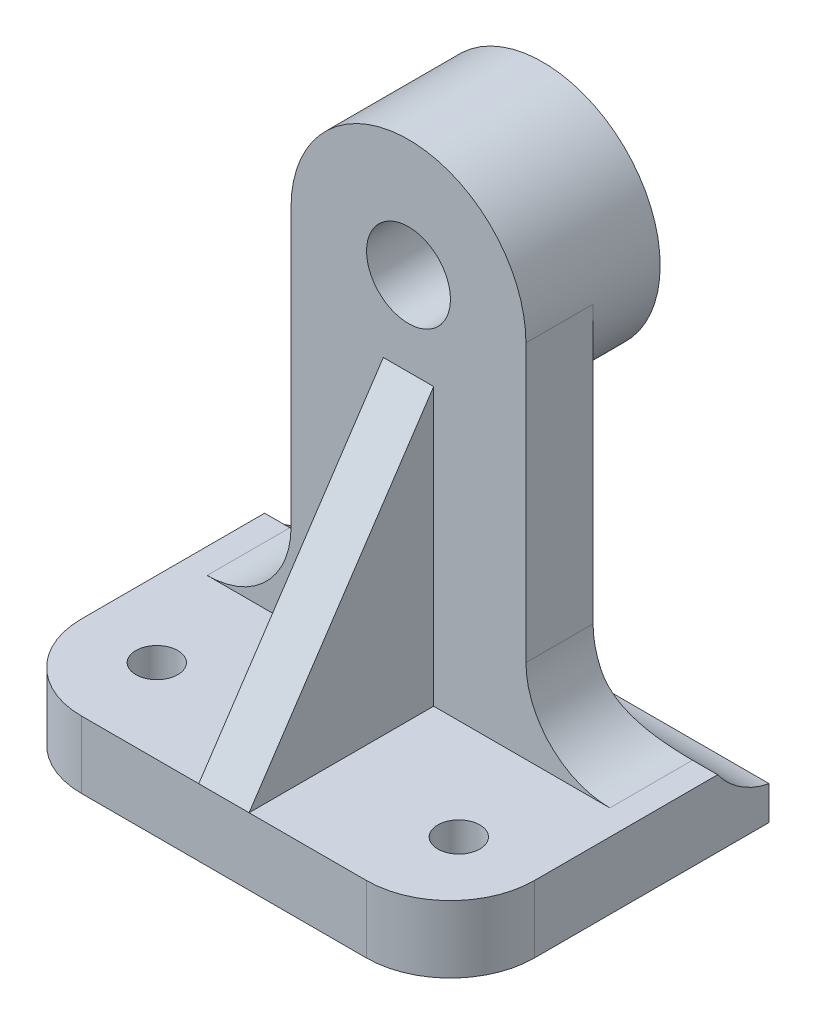
ISO-10303-21;
HEADER;
FILE_DESCRIPTION(('STEP AP214'),'2;1');
FILE_NAME('part.step','',(''),(''),'','','');
FILE_SCHEMA(('AUTOMOTIVE_DESIGN { 1 0 10303 214 1 1 1 1 }'));
ENDSEC;
DATA;
#1=APPLICATION_CONTEXT('core data for automotive mechanical design processes');
#2=APPLICATION_PROTOCOL_DEFINITION('international standard','automotive_design',2000,#1);
#3=PRODUCT_CONTEXT('',#1,'mechanical');
#4=PRODUCT('Part','Part','',(#3));
#5=PRODUCT_RELATED_PRODUCT_CATEGORY('part','',(#4));
#6=PRODUCT_DEFINITION_FORMATION('','',#4);
#7=PRODUCT_DEFINITION_CONTEXT('part definition',#1,'design');
#8=PRODUCT_DEFINITION('design','',#6,#7);
#9=PRODUCT_DEFINITION_SHAPE('','',#8);
#10=(LENGTH_UNIT() NAMED_UNIT(*) SI_UNIT(.MILLI.,.METRE.));
#11=(NAMED_UNIT(*) PLANE_ANGLE_UNIT() SI_UNIT($,.RADIAN.));
#12=(NAMED_UNIT(*) SI_UNIT($,.STERADIAN.) SOLID_ANGLE_UNIT());
#13=UNCERTAINTY_MEASURE_WITH_UNIT(LENGTH_MEASURE(1.E-05),#10,'distance_accuracy_value','');
#14=(GEOMETRIC_REPRESENTATION_CONTEXT(3) GLOBAL_UNCERTAINTY_ASSIGNED_CONTEXT((#13)) GLOBAL_UNIT_ASSIGNED_CONTEXT((#10,
#11,#12)) REPRESENTATION_CONTEXT('',''));
#15=CARTESIAN_POINT('',(0.,0.,0.));
#16=DIRECTION('',(0.,0.,1.));
#17=DIRECTION('',(1.,0.,0.));
#18=AXIS2_PLACEMENT_3D('',#15,#16,#17);
#19=CARTESIAN_POINT('',(54.,9.83333333333334,6.91666666666667));
#20=DIRECTION('',(0.,0.,1.));
#21=DIRECTION('',(1.,0.,0.));
#22=AXIS2_PLACEMENT_3D('',#19,#20,#21);
#23=PLANE('',#22);
#24=CARTESIAN_POINT('',(51.,19.8333333333333,6.91666666666667));
#25=DIRECTION('',(0.,0.,1.));
#26=DIRECTION('',(1.,0.,0.));
#27=AXIS2_PLACEMENT_3D('',#24,#25,#26);
#28=CIRCLE('',#27,10.);
#29=CARTESIAN_POINT('',(41.,19.8333333333333,6.91666666666667));
#30=VERTEX_POINT('',#29);
#31=CARTESIAN_POINT('',(41.9257038183826,15.6312923044661,6.91666666666667));
#32=VERTEX_POINT('',#31);
#33=EDGE_CURVE('E271',#30,#32,#28,.T.);
#34=ORIENTED_EDGE('',*,*,#33,.T.);
#35=DIRECTION('',(-1.,0.,0.));
#36=VECTOR('',#35,1.);
#37=CARTESIAN_POINT('',(54.,15.6312923044661,6.91666666666667));
#38=LINE('',#37,#36);
#39=CARTESIAN_POINT('',(12.0742961816174,15.6312923044661,6.91666666666667));
#40=VERTEX_POINT('',#39);
#41=EDGE_CURVE('E275',#32,#40,#38,.T.);
#42=ORIENTED_EDGE('',*,*,#41,.T.);
#43=CARTESIAN_POINT('',(3.00000000000001,19.8333333333333,6.91666666666667));
#44=DIRECTION('',(0.,0.,1.));
#45=DIRECTION('',(1.,0.,0.));
#46=AXIS2_PLACEMENT_3D('',#43,#44,#45);
#47=CIRCLE('',#46,10.);
#48=CARTESIAN_POINT('',(13.,19.8333333333333,6.91666666666667));
#49=VERTEX_POINT('',#48);
#50=EDGE_CURVE('E266',#40,#49,#47,.T.);
#51=ORIENTED_EDGE('',*,*,#50,.T.);
#52=DIRECTION('',(0.,-1.,0.));
#53=VECTOR('',#52,1.);
#54=CARTESIAN_POINT('',(13.,0.,6.91666666666667));
#55=LINE('',#54,#53);
#56=CARTESIAN_POINT('',(13.,52.8333333333333,6.91666666666667));
#57=VERTEX_POINT('',#56);
#58=EDGE_CURVE('E175',#57,#49,#55,.T.);
#59=ORIENTED_EDGE('',*,*,#58,.F.);
#60=CARTESIAN_POINT('',(27.,52.8333333333333,6.91666666666667));
#61=DIRECTION('',(0.,0.,-1.));
#62=DIRECTION('',(-1.,0.,0.));
#63=AXIS2_PLACEMENT_3D('',#60,#61,#62);
#64=CIRCLE('',#63,14.);
#65=CARTESIAN_POINT('',(41.,52.8333333333333,6.91666666666667));
#66=VERTEX_POINT('',#65);
#67=EDGE_CURVE('E182',#66,#57,#64,.T.);
#68=ORIENTED_EDGE('',*,*,#67,.F.);
#69=DIRECTION('',(0.,-1.,0.));
#70=VECTOR('',#69,1.);
#71=CARTESIAN_POINT('',(41.,0.,6.91666666666667));
#72=LINE('',#71,#70);
#73=EDGE_CURVE('E163',#66,#30,#72,.T.);
#74=ORIENTED_EDGE('',*,*,#73,.T.);
#75=EDGE_LOOP('',(#34,#42,#51,#59,#68,#74));
#76=FACE_BOUND('',#75,.T.);
#77=ADVANCED_FACE('F44',(#76),#23,.F.);
#78=CARTESIAN_POINT('',(54.,9.83333333333334,6.91666666666667));
#79=DIRECTION('',(0.,-1.,0.));
#80=DIRECTION('',(0.,0.,-1.));
#81=AXIS2_PLACEMENT_3D('',#78,#79,#80);
#82=PLANE('',#81);
#83=CARTESIAN_POINT('',(9.,9.83333333333333,26.9166666666667));
#84=DIRECTION('',(0.,1.,0.));
#85=DIRECTION('',(0.,0.,1.));
#86=AXIS2_PLACEMENT_3D('',#83,#84,#85);
#87=CIRCLE('',#86,2.5);
#88=CARTESIAN_POINT('',(9.,9.83333333333333,29.4166666666667));
#89=VERTEX_POINT('',#88);
#90=EDGE_CURVE('E533',#89,#89,#87,.T.);
#91=ORIENTED_EDGE('',*,*,#90,.F.);
#92=EDGE_LOOP('',(#91));
#93=FACE_BOUND('',#92,.T.);
#94=DIRECTION('',(0.,0.,1.));
#95=VECTOR('',#94,1.);
#96=CARTESIAN_POINT('',(0.,9.83333333333334,6.91666666666667));
#97=LINE('',#96,#95);
#98=CARTESIAN_POINT('',(0.,9.83333333333334,5.06428421838481));
#99=VERTEX_POINT('',#98);
#100=CARTESIAN_POINT('',(0.,9.83333333333333,26.9166666666667));
#101=VERTEX_POINT('',#100);
#102=EDGE_CURVE('E185',#99,#101,#97,.T.);
#103=ORIENTED_EDGE('',*,*,#102,.T.);
#104=CARTESIAN_POINT('',(10.,9.83333333333333,26.9166666666667));
#105=DIRECTION('',(0.,-1.,0.));
#106=DIRECTION('',(0.,0.,-1.));
#107=AXIS2_PLACEMENT_3D('',#104,#105,#106);
#108=CIRCLE('',#107,10.);
#109=CARTESIAN_POINT('',(10.,9.83333333333333,36.9166666666667));
#110=VERTEX_POINT('',#109);
#111=EDGE_CURVE('E321',#101,#110,#108,.F.);
#112=ORIENTED_EDGE('',*,*,#111,.T.);
#113=DIRECTION('',(-1.,0.,0.));
#114=VECTOR('',#113,1.);
#115=CARTESIAN_POINT('',(54.,9.83333333333333,36.9166666666667));
#116=LINE('',#115,#114);
#117=CARTESIAN_POINT('',(24.,9.83333333333333,36.9166666666667));
#118=VERTEX_POINT('',#117);
#119=EDGE_CURVE('E248',#118,#110,#116,.T.);
#120=ORIENTED_EDGE('',*,*,#119,.F.);
#121=DIRECTION('',(0.,0.,1.));
#122=VECTOR('',#121,1.);
#123=CARTESIAN_POINT('',(24.,9.83333333333334,6.91666666666667));
#124=LINE('',#123,#122);
#125=CARTESIAN_POINT('',(24.,9.83333333333334,14.9166666666667));
#126=VERTEX_POINT('',#125);
#127=EDGE_CURVE('E203',#126,#118,#124,.T.);
#128=ORIENTED_EDGE('',*,*,#127,.F.);
#129=DIRECTION('',(1.,0.,0.));
#130=VECTOR('',#129,1.);
#131=CARTESIAN_POINT('',(0.,9.83333333333334,14.9166666666667));
#132=LINE('',#131,#130);
#133=CARTESIAN_POINT('',(3.00000000000001,9.83333333333334,14.9166666666667));
#134=VERTEX_POINT('',#133);
#135=EDGE_CURVE('E223',#134,#126,#132,.T.);
#136=ORIENTED_EDGE('',*,*,#135,.F.);
#137=DIRECTION('',(0.,0.,-1.));
#138=VECTOR('',#137,1.);
#139=CARTESIAN_POINT('',(3.00000000000001,9.83333333333334,6.91666666666667));
#140=LINE('',#139,#138);
#141=CARTESIAN_POINT('',(3.00000000000001,9.83333333333334,5.06428421838481));
#142=VERTEX_POINT('',#141);
#143=EDGE_CURVE('E258',#134,#142,#140,.T.);
#144=ORIENTED_EDGE('',*,*,#143,.T.);
#145=DIRECTION('',(-1.,0.,0.));
#146=VECTOR('',#145,1.);
#147=CARTESIAN_POINT('',(3.00000000000001,9.83333333333333,5.06428421838481));
#148=LINE('',#147,#146);
#149=EDGE_CURVE('E287',#142,#99,#148,.T.);
#150=ORIENTED_EDGE('',*,*,#149,.T.);
#151=EDGE_LOOP('',(#103,#112,#120,#128,#136,#144,#150));
#152=FACE_BOUND('',#151,.T.);
#153=ADVANCED_FACE('F369',(#93,#152),#82,.F.);
#154=CARTESIAN_POINT('',(45.,9.83333333333333,26.9166666666667));
#155=DIRECTION('',(0.,1.,0.));
#156=DIRECTION('',(0.,0.,1.));
#157=AXIS2_PLACEMENT_3D('',#154,#155,#156);
#158=CIRCLE('',#157,2.5);
#159=CARTESIAN_POINT('',(45.,9.83333333333333,29.4166666666667));
#160=VERTEX_POINT('',#159);
#161=EDGE_CURVE('E534',#160,#160,#158,.T.);
#162=ORIENTED_EDGE('',*,*,#161,.F.);
#163=EDGE_LOOP('',(#162));
#164=FACE_BOUND('',#163,.T.);
#165=CARTESIAN_POINT('',(44.,9.83333333333333,36.9166666666667));
#166=VERTEX_POINT('',#165);
#167=CARTESIAN_POINT('',(30.,9.83333333333333,36.9166666666667));
#168=VERTEX_POINT('',#167);
#169=EDGE_CURVE('E249',#166,#168,#116,.T.);
#170=ORIENTED_EDGE('',*,*,#169,.F.);
#171=CARTESIAN_POINT('',(44.,9.83333333333333,26.9166666666667));
#172=DIRECTION('',(0.,-1.,0.));
#173=DIRECTION('',(0.,0.,-1.));
#174=AXIS2_PLACEMENT_3D('',#171,#172,#173);
#175=CIRCLE('',#174,10.);
#176=CARTESIAN_POINT('',(54.,9.83333333333333,26.9166666666667));
#177=VERTEX_POINT('',#176);
#178=EDGE_CURVE('E11',#166,#177,#175,.F.);
#179=ORIENTED_EDGE('',*,*,#178,.T.);
#180=DIRECTION('',(0.,0.,1.));
#181=VECTOR('',#180,1.);
#182=CARTESIAN_POINT('',(54.,9.83333333333334,6.91666666666667));
#183=LINE('',#182,#181);
#184=CARTESIAN_POINT('',(54.,9.83333333333334,5.06428421838481));
#185=VERTEX_POINT('',#184);
#186=EDGE_CURVE('E227',#185,#177,#183,.T.);
#187=ORIENTED_EDGE('',*,*,#186,.F.);
#188=DIRECTION('',(-1.,0.,0.));
#189=VECTOR('',#188,1.);
#190=CARTESIAN_POINT('',(54.,9.83333333333334,5.06428421838481));
#191=LINE('',#190,#189);
#192=CARTESIAN_POINT('',(51.,9.83333333333334,5.06428421838481));
#193=VERTEX_POINT('',#192);
#194=EDGE_CURVE('E310',#185,#193,#191,.T.);
#195=ORIENTED_EDGE('',*,*,#194,.T.);
#196=DIRECTION('',(0.,0.,-1.));
#197=VECTOR('',#196,1.);
#198=CARTESIAN_POINT('',(51.,9.83333333333334,6.91666666666667));
#199=LINE('',#198,#197);
#200=CARTESIAN_POINT('',(51.,9.83333333333334,14.9166666666667));
#201=VERTEX_POINT('',#200);
#202=EDGE_CURVE('E263',#193,#201,#199,.F.);
#203=ORIENTED_EDGE('',*,*,#202,.T.);
#204=CARTESIAN_POINT('',(30.,9.83333333333334,14.9166666666667));
#205=VERTEX_POINT('',#204);
#206=EDGE_CURVE('E222',#205,#201,#132,.T.);
#207=ORIENTED_EDGE('',*,*,#206,.F.);
#208=DIRECTION('',(0.,0.,1.));
#209=VECTOR('',#208,1.);
#210=CARTESIAN_POINT('',(30.,9.83333333333334,6.91666666666667));
#211=LINE('',#210,#209);
#212=EDGE_CURVE('E208',#205,#168,#211,.T.);
#213=ORIENTED_EDGE('',*,*,#212,.T.);
#214=EDGE_LOOP('',(#170,#179,#187,#195,#203,#207,#213));
#215=FACE_BOUND('',#214,.T.);
#216=ADVANCED_FACE('F345',(#164,#215),#82,.F.);
#217=CARTESIAN_POINT('',(54.,9.83333333333333,36.9166666666667));
#218=DIRECTION('',(0.,0.,-1.));
#219=DIRECTION('',(-1.,0.,0.));
#220=AXIS2_PLACEMENT_3D('',#217,#218,#219);
#221=PLANE('',#220);
#222=ORIENTED_EDGE('',*,*,#119,.T.);
#223=DIRECTION('',(0.,-1.,0.));
#224=VECTOR('',#223,1.);
#225=CARTESIAN_POINT('',(10.,9.83333333333333,36.9166666666667));
#226=LINE('',#225,#224);
#227=CARTESIAN_POINT('',(10.,1.83333333333333,36.9166666666667));
#228=VERTEX_POINT('',#227);
#229=EDGE_CURVE('E313',#110,#228,#226,.T.);
#230=ORIENTED_EDGE('',*,*,#229,.T.);
#231=DIRECTION('',(-1.,0.,0.));
#232=VECTOR('',#231,1.);
#233=CARTESIAN_POINT('',(54.,1.83333333333333,36.9166666666667));
#234=LINE('',#233,#232);
#235=CARTESIAN_POINT('',(44.,1.83333333333333,36.9166666666667));
#236=VERTEX_POINT('',#235);
#237=EDGE_CURVE('E245',#236,#228,#234,.T.);
#238=ORIENTED_EDGE('',*,*,#237,.F.);
#239=DIRECTION('',(0.,-1.,0.));
#240=VECTOR('',#239,1.);
#241=CARTESIAN_POINT('',(44.,9.83333333333333,36.9166666666667));
#242=LINE('',#241,#240);
#243=EDGE_CURVE('E309',#236,#166,#242,.F.);
#244=ORIENTED_EDGE('',*,*,#243,.T.);
#245=ORIENTED_EDGE('',*,*,#169,.T.);
#246=DIRECTION('',(-1.,0.,0.));
#247=VECTOR('',#246,1.);
#248=CARTESIAN_POINT('',(54.,9.83333333333333,36.9166666666667));
#249=LINE('',#248,#247);
#250=EDGE_CURVE('E211',#118,#168,#249,.F.);
#251=ORIENTED_EDGE('',*,*,#250,.F.);
#252=EDGE_LOOP('',(#222,#230,#238,#244,#245,#251));
#253=FACE_BOUND('',#252,.T.);
#254=ADVANCED_FACE('F363',(#253),#221,.F.);
#255=CARTESIAN_POINT('',(54.,1.83333333333333,19.3333333333333));
#256=DIRECTION('',(0.,1.,0.));
#257=DIRECTION('',(0.,0.,1.));
#258=AXIS2_PLACEMENT_3D('',#255,#256,#257);
#259=PLANE('',#258);
#260=CARTESIAN_POINT('',(9.,1.83333333333333,26.9166666666667));
#261=DIRECTION('',(0.,1.,0.));
#262=DIRECTION('',(0.,0.,1.));
#263=AXIS2_PLACEMENT_3D('',#260,#261,#262);
#264=CIRCLE('',#263,2.5);
#265=CARTESIAN_POINT('',(9.,1.83333333333333,29.4166666666667));
#266=VERTEX_POINT('',#265);
#267=EDGE_CURVE('E197',#266,#266,#264,.T.);
#268=ORIENTED_EDGE('',*,*,#267,.T.);
#269=EDGE_LOOP('',(#268));
#270=FACE_BOUND('',#269,.T.);
#271=CARTESIAN_POINT('',(45.,1.83333333333333,26.9166666666667));
#272=DIRECTION('',(0.,1.,0.));
#273=DIRECTION('',(0.,0.,1.));
#274=AXIS2_PLACEMENT_3D('',#271,#272,#273);
#275=CIRCLE('',#274,2.5);
#276=CARTESIAN_POINT('',(45.,1.83333333333333,29.4166666666667));
#277=VERTEX_POINT('',#276);
#278=EDGE_CURVE('E538',#277,#277,#275,.T.);
#279=ORIENTED_EDGE('',*,*,#278,.T.);
#280=EDGE_LOOP('',(#279));
#281=FACE_BOUND('',#280,.T.);
#282=ORIENTED_EDGE('',*,*,#237,.T.);
#283=CARTESIAN_POINT('',(10.,1.83333333333333,26.9166666666667));
#284=DIRECTION('',(0.,1.,0.));
#285=DIRECTION('',(0.,0.,1.));
#286=AXIS2_PLACEMENT_3D('',#283,#284,#285);
#287=CIRCLE('',#286,10.);
#288=CARTESIAN_POINT('',(0.,1.83333333333333,26.9166666666667));
#289=VERTEX_POINT('',#288);
#290=EDGE_CURVE('E318',#228,#289,#287,.F.);
#291=ORIENTED_EDGE('',*,*,#290,.T.);
#292=DIRECTION('',(0.,0.,-1.));
#293=VECTOR('',#292,1.);
#294=CARTESIAN_POINT('',(0.,1.83333333333333,19.3333333333333));
#295=LINE('',#294,#293);
#296=CARTESIAN_POINT('',(0.,1.83333333333334,-1.08333333333333));
#297=VERTEX_POINT('',#296);
#298=EDGE_CURVE('E236',#289,#297,#295,.T.);
#299=ORIENTED_EDGE('',*,*,#298,.T.);
#300=DIRECTION('',(-1.,0.,0.));
#301=VECTOR('',#300,1.);
#302=CARTESIAN_POINT('',(54.,1.83333333333334,-1.08333333333333));
#303=LINE('',#302,#301);
#304=CARTESIAN_POINT('',(54.,1.83333333333334,-1.08333333333333));
#305=VERTEX_POINT('',#304);
#306=EDGE_CURVE('E242',#305,#297,#303,.T.);
#307=ORIENTED_EDGE('',*,*,#306,.F.);
#308=DIRECTION('',(0.,0.,-1.));
#309=VECTOR('',#308,1.);
#310=CARTESIAN_POINT('',(54.,1.83333333333333,19.3333333333333));
#311=LINE('',#310,#309);
#312=CARTESIAN_POINT('',(54.,1.83333333333333,26.9166666666667));
#313=VERTEX_POINT('',#312);
#314=EDGE_CURVE('E229',#313,#305,#311,.T.);
#315=ORIENTED_EDGE('',*,*,#314,.F.);
#316=CARTESIAN_POINT('',(44.,1.83333333333333,26.9166666666667));
#317=DIRECTION('',(0.,1.,0.));
#318=DIRECTION('',(0.,0.,1.));
#319=AXIS2_PLACEMENT_3D('',#316,#317,#318);
#320=CIRCLE('',#319,10.);
#321=EDGE_CURVE('E316',#313,#236,#320,.F.);
#322=ORIENTED_EDGE('',*,*,#321,.T.);
#323=EDGE_LOOP('',(#282,#291,#299,#307,#315,#322));
#324=FACE_BOUND('',#323,.T.);
#325=ADVANCED_FACE('F331',(#270,#281,#324),#259,.F.);
#326=CARTESIAN_POINT('',(54.,5.83333333333334,-1.08333333333333));
#327=DIRECTION('',(0.,0.,1.));
#328=DIRECTION('',(1.,0.,0.));
#329=AXIS2_PLACEMENT_3D('',#326,#327,#328);
#330=PLANE('',#329);
#331=ORIENTED_EDGE('',*,*,#306,.T.);
#332=DIRECTION('',(0.,1.,0.));
#333=VECTOR('',#332,1.);
#334=CARTESIAN_POINT('',(0.,5.83333333333334,-1.08333333333333));
#335=LINE('',#334,#333);
#336=CARTESIAN_POINT('',(0.,5.83333333333334,-1.08333333333333));
#337=VERTEX_POINT('',#336);
#338=EDGE_CURVE('E230',#297,#337,#335,.T.);
#339=ORIENTED_EDGE('',*,*,#338,.T.);
#340=DIRECTION('',(-1.,0.,0.));
#341=VECTOR('',#340,1.);
#342=CARTESIAN_POINT('',(54.,5.83333333333334,-1.08333333333333));
#343=LINE('',#342,#341);
#344=CARTESIAN_POINT('',(54.,5.83333333333334,-1.08333333333333));
#345=VERTEX_POINT('',#344);
#346=EDGE_CURVE('E234',#345,#337,#343,.T.);
#347=ORIENTED_EDGE('',*,*,#346,.F.);
#348=DIRECTION('',(0.,1.,0.));
#349=VECTOR('',#348,1.);
#350=CARTESIAN_POINT('',(54.,5.83333333333334,-1.08333333333333));
#351=LINE('',#350,#349);
#352=EDGE_CURVE('E232',#305,#345,#351,.T.);
#353=ORIENTED_EDGE('',*,*,#352,.F.);
#354=EDGE_LOOP('',(#331,#339,#347,#353));
#355=FACE_BOUND('',#354,.T.);
#356=ADVANCED_FACE('F337',(#355),#330,.F.);
#357=CARTESIAN_POINT('',(54.,0.,0.));
#358=DIRECTION('',(1.,0.,0.));
#359=DIRECTION('',(0.,0.,-1.));
#360=AXIS2_PLACEMENT_3D('',#357,#358,#359);
#361=PLANE('',#360);
#362=ORIENTED_EDGE('',*,*,#186,.T.);
#363=DIRECTION('',(0.,-1.,0.));
#364=VECTOR('',#363,1.);
#365=CARTESIAN_POINT('',(54.,1.83333333333333,26.9166666666667));
#366=LINE('',#365,#364);
#367=EDGE_CURVE('E52',#177,#313,#366,.T.);
#368=ORIENTED_EDGE('',*,*,#367,.T.);
#369=ORIENTED_EDGE('',*,*,#314,.T.);
#370=ORIENTED_EDGE('',*,*,#352,.T.);
#371=CARTESIAN_POINT('',(54.,15.6312923044661,-3.08333333333333));
#372=DIRECTION('',(1.,0.,0.));
#373=DIRECTION('',(0.,0.,-1.));
#374=AXIS2_PLACEMENT_3D('',#371,#372,#373);
#375=CIRCLE('',#374,10.);
#376=EDGE_CURVE('E339',#345,#185,#375,.F.);
#377=ORIENTED_EDGE('',*,*,#376,.T.);
#378=EDGE_LOOP('',(#362,#368,#369,#370,#377));
#379=FACE_BOUND('',#378,.T.);
#380=ADVANCED_FACE('F326',(#379),#361,.T.);
#381=CARTESIAN_POINT('',(0.,0.,0.));
#382=DIRECTION('',(1.,0.,0.));
#383=DIRECTION('',(0.,0.,-1.));
#384=AXIS2_PLACEMENT_3D('',#381,#382,#383);
#385=PLANE('',#384);
#386=ORIENTED_EDGE('',*,*,#298,.F.);
#387=DIRECTION('',(0.,-1.,0.));
#388=VECTOR('',#387,1.);
#389=CARTESIAN_POINT('',(0.,0.,26.9166666666667));
#390=LINE('',#389,#388);
#391=EDGE_CURVE('E65',#289,#101,#390,.F.);
#392=ORIENTED_EDGE('',*,*,#391,.T.);
#393=ORIENTED_EDGE('',*,*,#102,.F.);
#394=CARTESIAN_POINT('',(0.,15.6312923044661,-3.08333333333333));
#395=DIRECTION('',(1.,0.,0.));
#396=DIRECTION('',(0.,0.,-1.));
#397=AXIS2_PLACEMENT_3D('',#394,#395,#396);
#398=CIRCLE('',#397,10.);
#399=EDGE_CURVE('E341',#99,#337,#398,.T.);
#400=ORIENTED_EDGE('',*,*,#399,.T.);
#401=ORIENTED_EDGE('',*,*,#338,.F.);
#402=EDGE_LOOP('',(#386,#392,#393,#400,#401));
#403=FACE_BOUND('',#402,.T.);
#404=ADVANCED_FACE('F374',(#403),#385,.F.);
#405=CARTESIAN_POINT('',(13.,0.,14.9166666666667));
#406=DIRECTION('',(1.,0.,0.));
#407=DIRECTION('',(0.,1.,0.));
#408=AXIS2_PLACEMENT_3D('',#405,#406,#407);
#409=PLANE('',#408);
#410=ORIENTED_EDGE('',*,*,#58,.T.);
#411=DIRECTION('',(0.,0.,-1.));
#412=VECTOR('',#411,1.);
#413=CARTESIAN_POINT('',(13.,19.8333333333333,14.9166666666667));
#414=LINE('',#413,#412);
#415=CARTESIAN_POINT('',(13.,19.8333333333333,14.9166666666667));
#416=VERTEX_POINT('',#415);
#417=EDGE_CURVE('E260',#49,#416,#414,.F.);
#418=ORIENTED_EDGE('',*,*,#417,.T.);
#419=DIRECTION('',(0.,-1.,0.));
#420=VECTOR('',#419,1.);
#421=CARTESIAN_POINT('',(13.,0.,14.9166666666667));
#422=LINE('',#421,#420);
#423=CARTESIAN_POINT('',(13.,52.8333333333333,14.9166666666667));
#424=VERTEX_POINT('',#423);
#425=EDGE_CURVE('E216',#424,#416,#422,.T.);
#426=ORIENTED_EDGE('',*,*,#425,.F.);
#427=DIRECTION('',(0.,0.,-1.));
#428=VECTOR('',#427,1.);
#429=CARTESIAN_POINT('',(13.,52.8333333333333,14.9166666666667));
#430=LINE('',#429,#428);
#431=EDGE_CURVE('E186',#424,#57,#430,.T.);
#432=ORIENTED_EDGE('',*,*,#431,.T.);
#433=EDGE_LOOP('',(#410,#418,#426,#432));
#434=FACE_BOUND('',#433,.T.);
#435=ADVANCED_FACE('F383',(#434),#409,.F.);
#436=CARTESIAN_POINT('',(41.,0.,14.9166666666667));
#437=DIRECTION('',(1.,0.,0.));
#438=DIRECTION('',(0.,0.,-1.));
#439=AXIS2_PLACEMENT_3D('',#436,#437,#438);
#440=PLANE('',#439);
#441=DIRECTION('',(0.,-1.,0.));
#442=VECTOR('',#441,1.);
#443=CARTESIAN_POINT('',(41.,0.,14.9166666666667));
#444=LINE('',#443,#442);
#445=CARTESIAN_POINT('',(41.,52.8333333333333,14.9166666666667));
#446=VERTEX_POINT('',#445);
#447=CARTESIAN_POINT('',(41.,19.8333333333333,14.9166666666667));
#448=VERTEX_POINT('',#447);
#449=EDGE_CURVE('E220',#446,#448,#444,.T.);
#450=ORIENTED_EDGE('',*,*,#449,.T.);
#451=DIRECTION('',(0.,0.,-1.));
#452=VECTOR('',#451,1.);
#453=CARTESIAN_POINT('',(41.,19.8333333333333,14.9166666666667));
#454=LINE('',#453,#452);
#455=EDGE_CURVE('E170',#448,#30,#454,.T.);
#456=ORIENTED_EDGE('',*,*,#455,.T.);
#457=ORIENTED_EDGE('',*,*,#73,.F.);
#458=DIRECTION('',(0.,0.,-1.));
#459=VECTOR('',#458,1.);
#460=CARTESIAN_POINT('',(41.,52.8333333333333,14.9166666666667));
#461=LINE('',#460,#459);
#462=EDGE_CURVE('E167',#446,#66,#461,.T.);
#463=ORIENTED_EDGE('',*,*,#462,.F.);
#464=EDGE_LOOP('',(#450,#456,#457,#463));
#465=FACE_BOUND('',#464,.T.);
#466=ADVANCED_FACE('F166',(#465),#440,.T.);
#467=CARTESIAN_POINT('',(27.,52.8333333333333,14.9166666666667));
#468=DIRECTION('',(0.,0.,-1.));
#469=DIRECTION('',(-1.,0.,0.));
#470=AXIS2_PLACEMENT_3D('',#467,#468,#469);
#471=CYLINDRICAL_SURFACE('',#470,5.);
#472=CARTESIAN_POINT('',(27.,52.8333333333333,14.9166666666667));
#473=DIRECTION('',(0.,0.,-1.));
#474=DIRECTION('',(-1.,0.,0.));
#475=AXIS2_PLACEMENT_3D('',#472,#473,#474);
#476=CIRCLE('',#475,5.);
#477=CARTESIAN_POINT('',(22.,52.8333333333333,14.9166666666667));
#478=VERTEX_POINT('',#477);
#479=EDGE_CURVE('E174',#478,#478,#476,.T.);
#480=ORIENTED_EDGE('',*,*,#479,.F.);
#481=EDGE_LOOP('',(#480));
#482=FACE_BOUND('',#481,.T.);
#483=CARTESIAN_POINT('',(27.,52.8333333333333,-1.08333333333333));
#484=DIRECTION('',(0.,0.,-1.));
#485=DIRECTION('',(-1.,0.,0.));
#486=AXIS2_PLACEMENT_3D('',#483,#484,#485);
#487=CIRCLE('',#486,5.00000000000001);
#488=CARTESIAN_POINT('',(22.,52.8333333333333,-1.08333333333333));
#489=VERTEX_POINT('',#488);
#490=EDGE_CURVE('E191',#489,#489,#487,.T.);
#491=ORIENTED_EDGE('',*,*,#490,.T.);
#492=EDGE_LOOP('',(#491));
#493=FACE_BOUND('',#492,.T.);
#494=ADVANCED_FACE('F391',(#482,#493),#471,.F.);
#495=CARTESIAN_POINT('',(27.,52.8333333333333,14.9166666666667));
#496=DIRECTION('',(0.,0.,-1.));
#497=DIRECTION('',(-1.,0.,0.));
#498=AXIS2_PLACEMENT_3D('',#495,#496,#497);
#499=CYLINDRICAL_SURFACE('',#498,14.);
#500=ORIENTED_EDGE('',*,*,#462,.T.);
#501=ORIENTED_EDGE('',*,*,#67,.T.);
#502=ORIENTED_EDGE('',*,*,#431,.F.);
#503=CARTESIAN_POINT('',(27.,52.8333333333333,14.9166666666667));
#504=DIRECTION('',(0.,0.,-1.));
#505=DIRECTION('',(-1.,0.,0.));
#506=AXIS2_PLACEMENT_3D('',#503,#504,#505);
#507=CIRCLE('',#506,14.);
#508=EDGE_CURVE('E184',#424,#446,#507,.T.);
#509=ORIENTED_EDGE('',*,*,#508,.T.);
#510=EDGE_LOOP('',(#500,#501,#502,#509));
#511=FACE_BOUND('',#510,.T.);
#512=CARTESIAN_POINT('',(27.,52.8333333333333,-1.08333333333333));
#513=DIRECTION('',(0.,0.,-1.));
#514=DIRECTION('',(-1.,0.,0.));
#515=AXIS2_PLACEMENT_3D('',#512,#513,#514);
#516=CIRCLE('',#515,14.);
#517=CARTESIAN_POINT('',(13.,52.8333333333333,-1.08333333333333));
#518=VERTEX_POINT('',#517);
#519=EDGE_CURVE('E190',#518,#518,#516,.T.);
#520=ORIENTED_EDGE('',*,*,#519,.F.);
#521=EDGE_LOOP('',(#520));
#522=FACE_BOUND('',#521,.T.);
#523=ADVANCED_FACE('F180',(#511,#522),#499,.T.);
#524=CARTESIAN_POINT('',(0.,0.,14.9166666666667));
#525=DIRECTION('',(0.,0.,-1.));
#526=DIRECTION('',(-1.,0.,0.));
#527=AXIS2_PLACEMENT_3D('',#524,#525,#526);
#528=PLANE('',#527);
#529=ORIENTED_EDGE('',*,*,#479,.T.);
#530=EDGE_LOOP('',(#529));
#531=FACE_BOUND('',#530,.T.);
#532=DIRECTION('',(-1.,0.,0.));
#533=VECTOR('',#532,1.);
#534=CARTESIAN_POINT('',(0.,42.8333333333333,14.9166666666667));
#535=LINE('',#534,#533);
#536=CARTESIAN_POINT('',(24.,42.8333333333333,14.9166666666667));
#537=VERTEX_POINT('',#536);
#538=CARTESIAN_POINT('',(30.,42.8333333333333,14.9166666666667));
#539=VERTEX_POINT('',#538);
#540=EDGE_CURVE('E254',#537,#539,#535,.F.);
#541=ORIENTED_EDGE('',*,*,#540,.T.);
#542=DIRECTION('',(0.,-1.,0.));
#543=VECTOR('',#542,1.);
#544=CARTESIAN_POINT('',(30.,0.,14.9166666666667));
#545=LINE('',#544,#543);
#546=EDGE_CURVE('E256',#539,#205,#545,.T.);
#547=ORIENTED_EDGE('',*,*,#546,.T.);
#548=ORIENTED_EDGE('',*,*,#206,.T.);
#549=CARTESIAN_POINT('',(51.,19.8333333333333,14.9166666666667));
#550=DIRECTION('',(0.,0.,-1.));
#551=DIRECTION('',(-1.,0.,0.));
#552=AXIS2_PLACEMENT_3D('',#549,#550,#551);
#553=CIRCLE('',#552,10.);
#554=EDGE_CURVE('E273',#201,#448,#553,.T.);
#555=ORIENTED_EDGE('',*,*,#554,.T.);
#556=ORIENTED_EDGE('',*,*,#449,.F.);
#557=ORIENTED_EDGE('',*,*,#508,.F.);
#558=ORIENTED_EDGE('',*,*,#425,.T.);
#559=CARTESIAN_POINT('',(3.00000000000001,19.8333333333333,14.9166666666667));
#560=DIRECTION('',(0.,0.,-1.));
#561=DIRECTION('',(-1.,0.,0.));
#562=AXIS2_PLACEMENT_3D('',#559,#560,#561);
#563=CIRCLE('',#562,10.);
#564=EDGE_CURVE('E268',#416,#134,#563,.T.);
#565=ORIENTED_EDGE('',*,*,#564,.T.);
#566=ORIENTED_EDGE('',*,*,#135,.T.);
#567=DIRECTION('',(0.,-1.,0.));
#568=VECTOR('',#567,1.);
#569=CARTESIAN_POINT('',(24.,0.,14.9166666666667));
#570=LINE('',#569,#568);
#571=EDGE_CURVE('E251',#537,#126,#570,.T.);
#572=ORIENTED_EDGE('',*,*,#571,.F.);
#573=EDGE_LOOP('',(#541,#547,#548,#555,#556,#557,#558,#565,#566,#572));
#574=FACE_BOUND('',#573,.T.);
#575=ADVANCED_FACE('F351',(#531,#574),#528,.F.);
#576=CARTESIAN_POINT('',(27.,9.83333333333333,36.9166666666667));
#577=DIRECTION('',(0.,-0.554700196225229,-0.832050294337844));
#578=DIRECTION('',(0.,0.832050294337844,-0.554700196225229));
#579=AXIS2_PLACEMENT_3D('',#576,#577,#578);
#580=PLANE('',#579);
#581=DIRECTION('',(0.,0.832050294337844,-0.554700196225229));
#582=VECTOR('',#581,1.);
#583=CARTESIAN_POINT('',(24.,9.83333333333333,36.9166666666667));
#584=LINE('',#583,#582);
#585=EDGE_CURVE('E194',#118,#537,#584,.T.);
#586=ORIENTED_EDGE('',*,*,#585,.F.);
#587=ORIENTED_EDGE('',*,*,#250,.T.);
#588=DIRECTION('',(0.,0.832050294337844,-0.554700196225229));
#589=VECTOR('',#588,1.);
#590=CARTESIAN_POINT('',(30.,9.83333333333333,36.9166666666667));
#591=LINE('',#590,#589);
#592=EDGE_CURVE('E200',#168,#539,#591,.T.);
#593=ORIENTED_EDGE('',*,*,#592,.T.);
#594=ORIENTED_EDGE('',*,*,#540,.F.);
#595=EDGE_LOOP('',(#586,#587,#593,#594));
#596=FACE_BOUND('',#595,.T.);
#597=ADVANCED_FACE('F359',(#596),#580,.F.);
#598=CARTESIAN_POINT('',(30.,34.3333333333333,17.9166666666667));
#599=DIRECTION('',(1.,0.,0.));
#600=DIRECTION('',(0.,0.,-1.));
#601=AXIS2_PLACEMENT_3D('',#598,#599,#600);
#602=PLANE('',#601);
#603=ORIENTED_EDGE('',*,*,#212,.F.);
#604=ORIENTED_EDGE('',*,*,#546,.F.);
#605=ORIENTED_EDGE('',*,*,#592,.F.);
#606=EDGE_LOOP('',(#603,#604,#605));
#607=FACE_BOUND('',#606,.T.);
#608=ADVANCED_FACE('F356',(#607),#602,.T.);
#609=CARTESIAN_POINT('',(24.,34.3333333333333,17.9166666666667));
#610=DIRECTION('',(1.,0.,0.));
#611=DIRECTION('',(0.,0.,-1.));
#612=AXIS2_PLACEMENT_3D('',#609,#610,#611);
#613=PLANE('',#612);
#614=ORIENTED_EDGE('',*,*,#571,.T.);
#615=ORIENTED_EDGE('',*,*,#127,.T.);
#616=ORIENTED_EDGE('',*,*,#585,.T.);
#617=EDGE_LOOP('',(#614,#615,#616));
#618=FACE_BOUND('',#617,.T.);
#619=ADVANCED_FACE('F367',(#618),#613,.F.);
#620=CARTESIAN_POINT('',(27.,52.8333333333333,-1.08333333333333));
#621=DIRECTION('',(0.,0.,-1.));
#622=DIRECTION('',(-1.,0.,0.));
#623=AXIS2_PLACEMENT_3D('',#620,#621,#622);
#624=PLANE('',#623);
#625=ORIENTED_EDGE('',*,*,#519,.T.);
#626=EDGE_LOOP('',(#625));
#627=FACE_BOUND('',#626,.T.);
#628=ORIENTED_EDGE('',*,*,#490,.F.);
#629=EDGE_LOOP('',(#628));
#630=FACE_BOUND('',#629,.T.);
#631=ADVANCED_FACE('F425',(#627,#630),#624,.T.);
#632=CARTESIAN_POINT('',(3.00000000000001,19.8333333333333,6.91666666666668));
#633=DIRECTION('',(0.,0.,1.));
#634=DIRECTION('',(0.,-1.,0.));
#635=AXIS2_PLACEMENT_3D('',#632,#633,#634);
#636=CYLINDRICAL_SURFACE('',#635,10.);
#637=ORIENTED_EDGE('',*,*,#564,.F.);
#638=ORIENTED_EDGE('',*,*,#417,.F.);
#639=ORIENTED_EDGE('',*,*,#50,.F.);
#640=CARTESIAN_POINT('',(12.0742961816174,15.6312923044661,6.91666666666667));
#641=CARTESIAN_POINT('',(12.0194927006663,15.5129396285598,6.91666821645901));
#642=CARTESIAN_POINT('',(11.9623810748807,15.39568558843,6.91456520916767));
#643=CARTESIAN_POINT('',(11.8436883396409,15.1636273458242,6.90639952345691));
#644=CARTESIAN_POINT('',(11.7821080231616,15.0488227133536,6.90033754604187));
#645=CARTESIAN_POINT('',(11.5910585640427,14.7087637783692,6.87661143641924));
#646=CARTESIAN_POINT('',(11.4551040259655,14.4874829079187,6.85340551345878));
#647=CARTESIAN_POINT('',(11.1685257877078,14.0591596766076,6.79466126525217));
#648=CARTESIAN_POINT('',(11.0180335404365,13.8520141724436,6.75922714774187));
#649=CARTESIAN_POINT('',(10.702661798647,13.4510066700296,6.67823469970538));
#650=CARTESIAN_POINT('',(10.5377774898358,13.2571491557627,6.63267297344623));
#651=CARTESIAN_POINT('',(10.1957534552024,12.8846120485234,6.53397794289837));
#652=CARTESIAN_POINT('',(10.018683509423,12.7058572756005,6.4808861598012));
#653=CARTESIAN_POINT('',(9.65262383864262,12.3630234155998,6.36923007114791));
#654=CARTESIAN_POINT('',(9.46363514815979,12.1989430577996,6.31066624034037));
#655=CARTESIAN_POINT('',(8.87860380471716,11.7282160508994,6.12965011456174));
#656=CARTESIAN_POINT('',(8.46546848868595,11.4441382446608,6.00217612462901));
#657=CARTESIAN_POINT('',(7.78878930810041,11.049957766572,5.80692780501907));
#658=CARTESIAN_POINT('',(7.53819262788095,10.9178761901815,5.73726732196423));
#659=CARTESIAN_POINT('',(7.02540918401658,10.6749219372262,5.60307116358297));
#660=CARTESIAN_POINT('',(6.76322011868073,10.5640534960634,5.53853651317847));
#661=CARTESIAN_POINT('',(6.22951808041454,10.3649075150499,5.41835437500026));
#662=CARTESIAN_POINT('',(5.95804096251561,10.2765522465365,5.3626765654965));
#663=CARTESIAN_POINT('',(5.40652881677727,10.1230079633519,5.26335461247005));
#664=CARTESIAN_POINT('',(5.12649897936219,10.0578051899161,5.21970332544964));
#665=CARTESIAN_POINT('',(4.69241578988887,9.97638981939488,5.16428597534999));
#666=CARTESIAN_POINT('',(4.54061428315965,9.95151982255777,5.14715012794886));
#667=CARTESIAN_POINT('',(4.23560830032693,9.90876938193604,5.11748441709771));
#668=CARTESIAN_POINT('',(4.08240420523992,9.89088709439523,5.10495333869913));
#669=CARTESIAN_POINT('',(3.77461836290676,9.86217951361402,5.08475476027117));
#670=CARTESIAN_POINT('',(3.62003408725192,9.85137247181527,5.07709984023718));
#671=CARTESIAN_POINT('',(3.31030249576206,9.836944065805,5.06685330322967));
#672=CARTESIAN_POINT('',(3.15515498040802,9.83332556182835,5.06426370169326));
#673=CARTESIAN_POINT('',(3.00000000000004,9.83333333333333,5.06428421838458));
#674=B_SPLINE_CURVE_WITH_KNOTS('',3,(#640,#641,#642,#643,#644,#645,#646,#647,#648,#649,#650,
#651,#652,#653,#654,#655,#656,#657,#658,#659,#660,#661,#662,#663,#664,#665,#666,#667,#668,#669,
#670,#671,#672,#673),.UNSPECIFIED.,.F.,.F.,(4,2,2,2,2,2,2,2,2,2,2,2,2,2,2,2,4),(0.,
0.391184773786307,0.782300300291313,1.5632751755138,2.33775259895252,3.11249009327682,
3.8831107069247,4.65366452438291,6.19912961138162,7.0734685038471,7.94798178454558,
8.81943352125219,9.69036651277256,10.1545003382928,10.6185116160153,11.0837151986285,
11.5491038432463),.UNSPECIFIED.);
#675=EDGE_CURVE('E278',#40,#142,#674,.T.);
#676=ORIENTED_EDGE('',*,*,#675,.T.);
#677=ORIENTED_EDGE('',*,*,#143,.F.);
#678=EDGE_LOOP('',(#637,#638,#639,#676,#677));
#679=FACE_BOUND('',#678,.T.);
#680=ADVANCED_FACE('F289',(#679),#636,.F.);
#681=CARTESIAN_POINT('',(51.,19.8333333333333,14.9166666666667));
#682=DIRECTION('',(0.,0.,-1.));
#683=DIRECTION('',(0.,1.,0.));
#684=AXIS2_PLACEMENT_3D('',#681,#682,#683);
#685=CYLINDRICAL_SURFACE('',#684,10.);
#686=ORIENTED_EDGE('',*,*,#554,.F.);
#687=ORIENTED_EDGE('',*,*,#202,.F.);
#688=CARTESIAN_POINT('',(51.,9.83333333333334,5.06428421838481));
#689=CARTESIAN_POINT('',(50.8695231642946,9.83333174663742,5.06427725963215));
#690=CARTESIAN_POINT('',(50.7390670721439,9.83588758194901,5.06610252220161));
#691=CARTESIAN_POINT('',(50.4784659368056,9.84609131111492,5.07335147990064));
#692=CARTESIAN_POINT('',(50.3483208663067,9.85373874004211,5.07877484647747));
#693=CARTESIAN_POINT('',(49.9590914765142,9.88425587731665,5.10032308694175));
#694=CARTESIAN_POINT('',(49.70083901807,9.91470058103732,5.12172647198975));
#695=CARTESIAN_POINT('',(49.1910899794752,9.99494458142083,5.1770484481288));
#696=CARTESIAN_POINT('',(48.9395544848316,10.0445759101259,5.21085830066823));
#697=CARTESIAN_POINT('',(48.4425452267985,10.1625173558969,5.28909170080386));
#698=CARTESIAN_POINT('',(48.1970730775321,10.2308323895473,5.33351804172157));
#699=CARTESIAN_POINT('',(47.7146478132961,10.3850374736797,5.43048171346991));
#700=CARTESIAN_POINT('',(47.4776611341342,10.4708464777464,5.48298137594885));
#701=CARTESIAN_POINT('',(47.0120841324116,10.6594755159669,5.59382186078575));
#702=CARTESIAN_POINT('',(46.7834934393209,10.7622947983214,5.65216242494983));
#703=CARTESIAN_POINT('',(46.1097501255452,11.0962239605519,5.83278681047731));
#704=CARTESIAN_POINT('',(45.67800135045,11.3523621834187,5.96037167492455));
#705=CARTESIAN_POINT('',(45.0366411453888,11.8010252700201,6.15572636265277));
#706=CARTESIAN_POINT('',(44.8123863058747,11.9724553863133,6.22527727353373));
#707=CARTESIAN_POINT('',(44.3782113055895,12.3345494864995,6.35958694460808));
#708=CARTESIAN_POINT('',(44.1682939913623,12.5252172712941,6.42434475340079));
#709=CARTESIAN_POINT('',(43.7649755215511,12.9243085297426,6.54555953277635));
#710=CARTESIAN_POINT('',(43.571518749537,13.132667038663,6.60204496193548));
#711=CARTESIAN_POINT('',(43.2019517454165,13.5666252118488,6.70373975424609));
#712=CARTESIAN_POINT('',(43.0258319454777,13.7922152429992,6.74895535827562));
#713=CARTESIAN_POINT('',(42.6804044681917,14.2764478231516,6.8277097463626));
#714=CARTESIAN_POINT('',(42.5125240086008,14.5363009899802,6.86016001069441));
#715=CARTESIAN_POINT('',(42.2786935318547,14.9381354052599,6.89352466194791));
#716=CARTESIAN_POINT('',(42.2036567393192,15.0742868696157,6.90209563385565));
#717=CARTESIAN_POINT('',(42.0598824883507,15.3501961109665,6.91366962542855));
#718=CARTESIAN_POINT('',(41.991148395916,15.4899557644666,6.91666968618686));
#719=CARTESIAN_POINT('',(41.9257038183826,15.6312923044661,6.91666666666667));
#720=B_SPLINE_CURVE_WITH_KNOTS('',3,(#688,#689,#690,#691,#692,#693,#694,#695,#696,#697,#698,
#699,#700,#701,#702,#703,#704,#705,#706,#707,#708,#709,#710,#711,#712,#713,#714,#715,#716,#717,
#718,#719),.UNSPECIFIED.,.F.,.F.,(4,2,2,2,2,2,2,2,2,2,2,2,2,2,2,4),(0.,0.391352204394321,
0.782668678263958,1.56418437290843,2.33900786131374,3.1140354396834,3.88555087784568,
4.65703222663359,6.20438006801843,7.07573657556353,7.94726558063184,8.81572213732838,
9.68369669596259,10.614803312203,11.0816554498655,11.5487554782746),.UNSPECIFIED.);
#721=EDGE_CURVE('E302',#193,#32,#720,.T.);
#722=ORIENTED_EDGE('',*,*,#721,.T.);
#723=ORIENTED_EDGE('',*,*,#33,.F.);
#724=ORIENTED_EDGE('',*,*,#455,.F.);
#725=EDGE_LOOP('',(#686,#687,#722,#723,#724));
#726=FACE_BOUND('',#725,.T.);
#727=ADVANCED_FACE('F297',(#726),#685,.F.);
#728=CARTESIAN_POINT('',(54.,15.6312923044661,-3.08333333333333));
#729=DIRECTION('',(-1.,0.,0.));
#730=DIRECTION('',(0.,0.,1.));
#731=AXIS2_PLACEMENT_3D('',#728,#729,#730);
#732=CYLINDRICAL_SURFACE('',#731,10.);
#733=ORIENTED_EDGE('',*,*,#376,.F.);
#734=ORIENTED_EDGE('',*,*,#346,.T.);
#735=ORIENTED_EDGE('',*,*,#399,.F.);
#736=ORIENTED_EDGE('',*,*,#149,.F.);
#737=ORIENTED_EDGE('',*,*,#675,.F.);
#738=ORIENTED_EDGE('',*,*,#41,.F.);
#739=ORIENTED_EDGE('',*,*,#721,.F.);
#740=ORIENTED_EDGE('',*,*,#194,.F.);
#741=EDGE_LOOP('',(#733,#734,#735,#736,#737,#738,#739,#740));
#742=FACE_BOUND('',#741,.T.);
#743=ADVANCED_FACE('F293',(#742),#732,.F.);
#744=CARTESIAN_POINT('',(10.,9.83333333333333,26.9166666666667));
#745=DIRECTION('',(0.,-1.,0.));
#746=DIRECTION('',(0.,0.,-1.));
#747=AXIS2_PLACEMENT_3D('',#744,#745,#746);
#748=CYLINDRICAL_SURFACE('',#747,10.);
#749=ORIENTED_EDGE('',*,*,#111,.F.);
#750=ORIENTED_EDGE('',*,*,#391,.F.);
#751=ORIENTED_EDGE('',*,*,#290,.F.);
#752=ORIENTED_EDGE('',*,*,#229,.F.);
#753=EDGE_LOOP('',(#749,#750,#751,#752));
#754=FACE_BOUND('',#753,.T.);
#755=ADVANCED_FACE('F296',(#754),#748,.T.);
#756=CARTESIAN_POINT('',(44.,0.,26.9166666666667));
#757=DIRECTION('',(0.,1.,0.));
#758=DIRECTION('',(0.,0.,1.));
#759=AXIS2_PLACEMENT_3D('',#756,#757,#758);
#760=CYLINDRICAL_SURFACE('',#759,10.);
#761=ORIENTED_EDGE('',*,*,#178,.F.);
#762=ORIENTED_EDGE('',*,*,#243,.F.);
#763=ORIENTED_EDGE('',*,*,#321,.F.);
#764=ORIENTED_EDGE('',*,*,#367,.F.);
#765=EDGE_LOOP('',(#761,#762,#763,#764));
#766=FACE_BOUND('',#765,.T.);
#767=ADVANCED_FACE('F46',(#766),#760,.T.);
#768=CARTESIAN_POINT('',(45.,1.83333333333333,26.9166666666667));
#769=DIRECTION('',(0.,1.,0.));
#770=DIRECTION('',(0.,0.,1.));
#771=AXIS2_PLACEMENT_3D('',#768,#769,#770);
#772=CYLINDRICAL_SURFACE('',#771,2.5);
#773=ORIENTED_EDGE('',*,*,#278,.F.);
#774=EDGE_LOOP('',(#773));
#775=FACE_BOUND('',#774,.T.);
#776=ORIENTED_EDGE('',*,*,#161,.T.);
#777=EDGE_LOOP('',(#776));
#778=FACE_BOUND('',#777,.T.);
#779=ADVANCED_FACE('F434',(#775,#778),#772,.F.);
#780=CARTESIAN_POINT('',(9.,1.83333333333333,26.9166666666667));
#781=DIRECTION('',(0.,1.,0.));
#782=DIRECTION('',(0.,0.,1.));
#783=AXIS2_PLACEMENT_3D('',#780,#781,#782);
#784=CYLINDRICAL_SURFACE('',#783,2.5);
#785=ORIENTED_EDGE('',*,*,#267,.F.);
#786=EDGE_LOOP('',(#785));
#787=FACE_BOUND('',#786,.T.);
#788=ORIENTED_EDGE('',*,*,#90,.T.);
#789=EDGE_LOOP('',(#788));
#790=FACE_BOUND('',#789,.T.);
#791=ADVANCED_FACE('F517',(#787,#790),#784,.F.);
#792=CLOSED_SHELL('',(#77,#153,#216,#254,#325,#356,#380,#404,#435,#466,#494,#523,#575,#597,#608,
#619,#631,#680,#727,#743,#755,#767,#779,#791));
#793=MANIFOLD_SOLID_BREP('B2',#792);
#794=ADVANCED_BREP_SHAPE_REPRESENTATION('',(#18,#793),#14);
#795=SHAPE_DEFINITION_REPRESENTATION(#9,#794);
ENDSEC;
END-ISO-10303-21;
